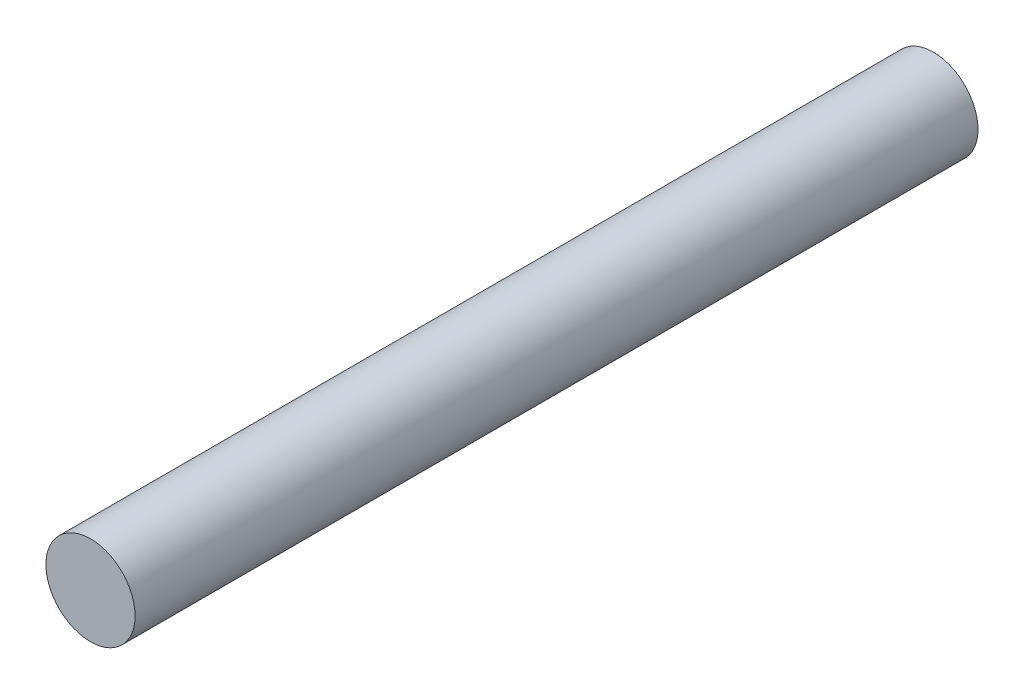
ISO-10303-21;
HEADER;
FILE_DESCRIPTION(('STEP AP214'),'2;1');
FILE_NAME('part.step','',(''),(''),'','','');
FILE_SCHEMA(('AUTOMOTIVE_DESIGN { 1 0 10303 214 1 1 1 1 }'));
ENDSEC;
DATA;
#1=APPLICATION_CONTEXT('core data for automotive mechanical design processes');
#2=APPLICATION_PROTOCOL_DEFINITION('international standard','automotive_design',2000,#1);
#3=PRODUCT_CONTEXT('',#1,'mechanical');
#4=PRODUCT('Part','Part','',(#3));
#5=PRODUCT_RELATED_PRODUCT_CATEGORY('part','',(#4));
#6=PRODUCT_DEFINITION_FORMATION('','',#4);
#7=PRODUCT_DEFINITION_CONTEXT('part definition',#1,'design');
#8=PRODUCT_DEFINITION('design','',#6,#7);
#9=PRODUCT_DEFINITION_SHAPE('','',#8);
#10=(LENGTH_UNIT() NAMED_UNIT(*) SI_UNIT(.MILLI.,.METRE.));
#11=(NAMED_UNIT(*) PLANE_ANGLE_UNIT() SI_UNIT($,.RADIAN.));
#12=(NAMED_UNIT(*) SI_UNIT($,.STERADIAN.) SOLID_ANGLE_UNIT());
#13=UNCERTAINTY_MEASURE_WITH_UNIT(LENGTH_MEASURE(1.E-05),#10,'distance_accuracy_value','');
#14=(GEOMETRIC_REPRESENTATION_CONTEXT(3) GLOBAL_UNCERTAINTY_ASSIGNED_CONTEXT((#13)) GLOBAL_UNIT_ASSIGNED_CONTEXT((#10,
#11,#12)) REPRESENTATION_CONTEXT('',''));
#15=CARTESIAN_POINT('',(0.,0.,0.));
#16=DIRECTION('',(0.,0.,1.));
#17=DIRECTION('',(1.,0.,0.));
#18=AXIS2_PLACEMENT_3D('',#15,#16,#17);
#19=CARTESIAN_POINT('',(0.,0.,60.));
#20=DIRECTION('',(0.,0.,-1.));
#21=DIRECTION('',(-1.,0.,0.));
#22=AXIS2_PLACEMENT_3D('',#19,#20,#21);
#23=CYLINDRICAL_SURFACE('',#22,3.175);
#24=CARTESIAN_POINT('',(0.,0.,60.));
#25=DIRECTION('',(0.,0.,1.));
#26=DIRECTION('',(1.,0.,0.));
#27=AXIS2_PLACEMENT_3D('',#24,#25,#26);
#28=CIRCLE('',#27,3.175);
#29=CARTESIAN_POINT('',(3.175,0.,60.));
#30=VERTEX_POINT('',#29);
#31=EDGE_CURVE('E10',#30,#30,#28,.T.);
#32=ORIENTED_EDGE('',*,*,#31,.F.);
#33=EDGE_LOOP('',(#32));
#34=FACE_BOUND('',#33,.T.);
#35=CARTESIAN_POINT('',(0.,0.,0.));
#36=DIRECTION('',(0.,0.,1.));
#37=DIRECTION('',(1.,0.,0.));
#38=AXIS2_PLACEMENT_3D('',#35,#36,#37);
#39=CIRCLE('',#38,3.175);
#40=CARTESIAN_POINT('',(3.175,0.,0.));
#41=VERTEX_POINT('',#40);
#42=EDGE_CURVE('E38',#41,#41,#39,.T.);
#43=ORIENTED_EDGE('',*,*,#42,.T.);
#44=EDGE_LOOP('',(#43));
#45=FACE_BOUND('',#44,.T.);
#46=ADVANCED_FACE('F35',(#34,#45),#23,.T.);
#47=CARTESIAN_POINT('',(0.,0.,60.));
#48=DIRECTION('',(0.,0.,1.));
#49=DIRECTION('',(1.,0.,0.));
#50=AXIS2_PLACEMENT_3D('',#47,#48,#49);
#51=PLANE('',#50);
#52=ORIENTED_EDGE('',*,*,#31,.T.);
#53=EDGE_LOOP('',(#52));
#54=FACE_BOUND('',#53,.T.);
#55=ADVANCED_FACE('F52',(#54),#51,.T.);
#56=CARTESIAN_POINT('',(0.,0.,0.));
#57=DIRECTION('',(0.,0.,1.));
#58=DIRECTION('',(1.,0.,0.));
#59=AXIS2_PLACEMENT_3D('',#56,#57,#58);
#60=PLANE('',#59);
#61=ORIENTED_EDGE('',*,*,#42,.F.);
#62=EDGE_LOOP('',(#61));
#63=FACE_BOUND('',#62,.T.);
#64=ADVANCED_FACE('F50',(#63),#60,.F.);
#65=CLOSED_SHELL('',(#46,#55,#64));
#66=MANIFOLD_SOLID_BREP('B2',#65);
#67=ADVANCED_BREP_SHAPE_REPRESENTATION('',(#18,#66),#14);
#68=SHAPE_DEFINITION_REPRESENTATION(#9,#67);
ENDSEC;
END-ISO-10303-21;
